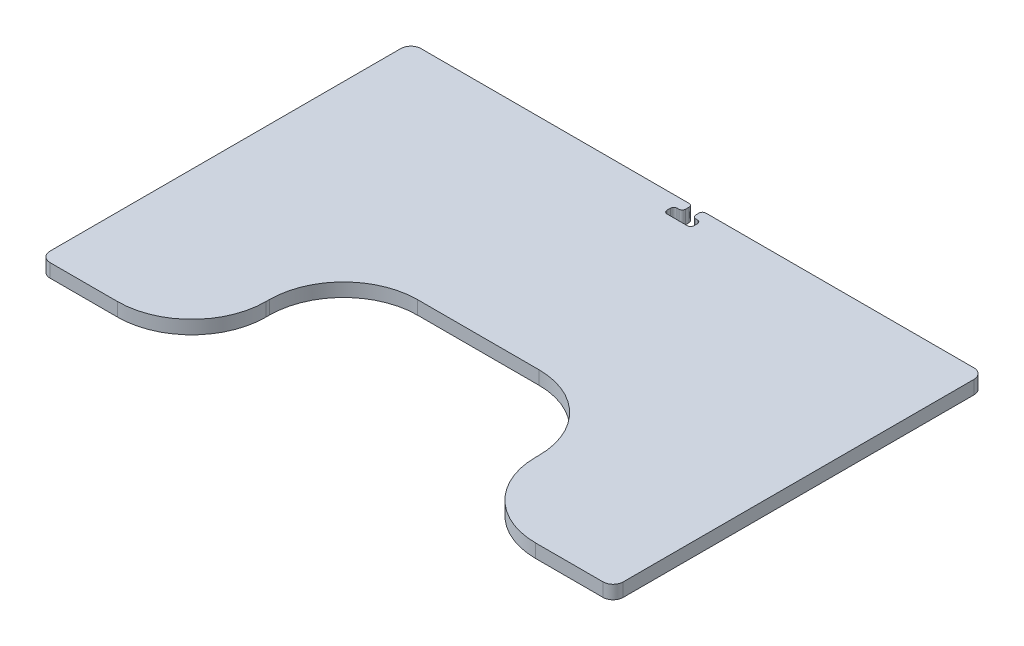
ISO-10303-21;
HEADER;
FILE_DESCRIPTION(('STEP AP214'),'2;1');
FILE_NAME('part.step','',(''),(''),'','','');
FILE_SCHEMA(('AUTOMOTIVE_DESIGN { 1 0 10303 214 1 1 1 1 }'));
ENDSEC;
DATA;
#1=APPLICATION_CONTEXT('core data for automotive mechanical design processes');
#2=APPLICATION_PROTOCOL_DEFINITION('international standard','automotive_design',2000,#1);
#3=PRODUCT_CONTEXT('',#1,'mechanical');
#4=PRODUCT('Part','Part','',(#3));
#5=PRODUCT_RELATED_PRODUCT_CATEGORY('part','',(#4));
#6=PRODUCT_DEFINITION_FORMATION('','',#4);
#7=PRODUCT_DEFINITION_CONTEXT('part definition',#1,'design');
#8=PRODUCT_DEFINITION('design','',#6,#7);
#9=PRODUCT_DEFINITION_SHAPE('','',#8);
#10=(LENGTH_UNIT() NAMED_UNIT(*) SI_UNIT(.MILLI.,.METRE.));
#11=(NAMED_UNIT(*) PLANE_ANGLE_UNIT() SI_UNIT($,.RADIAN.));
#12=(NAMED_UNIT(*) SI_UNIT($,.STERADIAN.) SOLID_ANGLE_UNIT());
#13=UNCERTAINTY_MEASURE_WITH_UNIT(LENGTH_MEASURE(1.E-05),#10,'distance_accuracy_value','');
#14=(GEOMETRIC_REPRESENTATION_CONTEXT(3) GLOBAL_UNCERTAINTY_ASSIGNED_CONTEXT((#13)) GLOBAL_UNIT_ASSIGNED_CONTEXT((#10,
#11,#12)) REPRESENTATION_CONTEXT('',''));
#15=CARTESIAN_POINT('',(0.,0.,0.));
#16=DIRECTION('',(0.,0.,1.));
#17=DIRECTION('',(1.,0.,0.));
#18=AXIS2_PLACEMENT_3D('',#15,#16,#17);
#19=CARTESIAN_POINT('',(850.,40.,-1100.));
#20=DIRECTION('',(0.,0.,1.));
#21=DIRECTION('',(1.,0.,0.));
#22=AXIS2_PLACEMENT_3D('',#19,#20,#21);
#23=PLANE('',#22);
#24=DIRECTION('',(-1.,0.,0.));
#25=VECTOR('',#24,1.);
#26=CARTESIAN_POINT('',(850.,40.,-1100.));
#27=LINE('',#26,#25);
#28=CARTESIAN_POINT('',(-25.,40.,-1100.));
#29=VERTEX_POINT('',#28);
#30=CARTESIAN_POINT('',(-820.,40.,-1100.));
#31=VERTEX_POINT('',#30);
#32=EDGE_CURVE('E461',#29,#31,#27,.T.);
#33=ORIENTED_EDGE('',*,*,#32,.F.);
#34=DIRECTION('',(0.,-1.,0.));
#35=VECTOR('',#34,1.);
#36=CARTESIAN_POINT('',(-25.,40.,-1100.));
#37=LINE('',#36,#35);
#38=CARTESIAN_POINT('',(-25.,0.,-1100.));
#39=VERTEX_POINT('',#38);
#40=EDGE_CURVE('E417',#29,#39,#37,.T.);
#41=ORIENTED_EDGE('',*,*,#40,.T.);
#42=DIRECTION('',(-1.,0.,0.));
#43=VECTOR('',#42,1.);
#44=CARTESIAN_POINT('',(850.,0.,-1100.));
#45=LINE('',#44,#43);
#46=CARTESIAN_POINT('',(-820.,0.,-1100.));
#47=VERTEX_POINT('',#46);
#48=EDGE_CURVE('E482',#39,#47,#45,.T.);
#49=ORIENTED_EDGE('',*,*,#48,.T.);
#50=DIRECTION('',(0.,-1.,0.));
#51=VECTOR('',#50,1.);
#52=CARTESIAN_POINT('',(-820.,40.,-1100.));
#53=LINE('',#52,#51);
#54=EDGE_CURVE('E324',#47,#31,#53,.F.);
#55=ORIENTED_EDGE('',*,*,#54,.T.);
#56=EDGE_LOOP('',(#33,#41,#49,#55));
#57=FACE_BOUND('',#56,.T.);
#58=ADVANCED_FACE('F34',(#57),#23,.F.);
#59=CARTESIAN_POINT('',(-400.,40.,-450.));
#60=DIRECTION('',(0.,0.,-1.));
#61=DIRECTION('',(-1.,0.,0.));
#62=AXIS2_PLACEMENT_3D('',#59,#60,#61);
#63=PLANE('',#62);
#64=DIRECTION('',(1.,0.,0.));
#65=VECTOR('',#64,1.);
#66=CARTESIAN_POINT('',(-400.,40.,-450.));
#67=LINE('',#66,#65);
#68=CARTESIAN_POINT('',(-180.,40.,-450.));
#69=VERTEX_POINT('',#68);
#70=CARTESIAN_POINT('',(180.,40.,-450.));
#71=VERTEX_POINT('',#70);
#72=EDGE_CURVE('E270',#69,#71,#67,.T.);
#73=ORIENTED_EDGE('',*,*,#72,.F.);
#74=DIRECTION('',(0.,-1.,0.));
#75=VECTOR('',#74,1.);
#76=CARTESIAN_POINT('',(-180.,0.,-450.));
#77=LINE('',#76,#75);
#78=CARTESIAN_POINT('',(-180.,0.,-450.));
#79=VERTEX_POINT('',#78);
#80=EDGE_CURVE('E289',#69,#79,#77,.T.);
#81=ORIENTED_EDGE('',*,*,#80,.T.);
#82=DIRECTION('',(1.,0.,0.));
#83=VECTOR('',#82,1.);
#84=CARTESIAN_POINT('',(-400.,0.,-450.));
#85=LINE('',#84,#83);
#86=CARTESIAN_POINT('',(180.,0.,-450.));
#87=VERTEX_POINT('',#86);
#88=EDGE_CURVE('E447',#79,#87,#85,.T.);
#89=ORIENTED_EDGE('',*,*,#88,.T.);
#90=DIRECTION('',(0.,-1.,0.));
#91=VECTOR('',#90,1.);
#92=CARTESIAN_POINT('',(180.,40.,-450.));
#93=LINE('',#92,#91);
#94=EDGE_CURVE('E287',#87,#71,#93,.F.);
#95=ORIENTED_EDGE('',*,*,#94,.T.);
#96=EDGE_LOOP('',(#73,#81,#89,#95));
#97=FACE_BOUND('',#96,.T.);
#98=ADVANCED_FACE('F506',(#97),#63,.F.);
#99=CARTESIAN_POINT('',(400.,40.,0.));
#100=DIRECTION('',(1.,0.,0.));
#101=DIRECTION('',(0.,0.,-1.));
#102=AXIS2_PLACEMENT_3D('',#99,#100,#101);
#103=PLANE('',#102);
#104=DIRECTION('',(0.,0.,1.));
#105=VECTOR('',#104,1.);
#106=CARTESIAN_POINT('',(400.,0.,0.));
#107=LINE('',#106,#105);
#108=CARTESIAN_POINT('',(400.,0.,-230.));
#109=VERTEX_POINT('',#108);
#110=CARTESIAN_POINT('',(400.,0.,-220.));
#111=VERTEX_POINT('',#110);
#112=EDGE_CURVE('E473',#109,#111,#107,.T.);
#113=ORIENTED_EDGE('',*,*,#112,.T.);
#114=DIRECTION('',(0.,-1.,0.));
#115=VECTOR('',#114,1.);
#116=CARTESIAN_POINT('',(400.,40.,-220.));
#117=LINE('',#116,#115);
#118=CARTESIAN_POINT('',(400.,40.,-220.));
#119=VERTEX_POINT('',#118);
#120=EDGE_CURVE('E298',#111,#119,#117,.F.);
#121=ORIENTED_EDGE('',*,*,#120,.T.);
#122=DIRECTION('',(0.,0.,1.));
#123=VECTOR('',#122,1.);
#124=CARTESIAN_POINT('',(400.,40.,0.));
#125=LINE('',#124,#123);
#126=CARTESIAN_POINT('',(400.,40.,-230.));
#127=VERTEX_POINT('',#126);
#128=EDGE_CURVE('E274',#127,#119,#125,.T.);
#129=ORIENTED_EDGE('',*,*,#128,.F.);
#130=DIRECTION('',(0.,-1.,0.));
#131=VECTOR('',#130,1.);
#132=CARTESIAN_POINT('',(400.,0.,-230.));
#133=LINE('',#132,#131);
#134=EDGE_CURVE('E295',#127,#109,#133,.T.);
#135=ORIENTED_EDGE('',*,*,#134,.T.);
#136=EDGE_LOOP('',(#113,#121,#129,#135));
#137=FACE_BOUND('',#136,.T.);
#138=ADVANCED_FACE('F515',(#137),#103,.F.);
#139=CARTESIAN_POINT('',(850.,40.,0.));
#140=DIRECTION('',(0.,0.,-1.));
#141=DIRECTION('',(-1.,0.,0.));
#142=AXIS2_PLACEMENT_3D('',#139,#140,#141);
#143=PLANE('',#142);
#144=DIRECTION('',(1.,0.,0.));
#145=VECTOR('',#144,1.);
#146=CARTESIAN_POINT('',(850.,0.,0.));
#147=LINE('',#146,#145);
#148=CARTESIAN_POINT('',(620.,0.,0.));
#149=VERTEX_POINT('',#148);
#150=CARTESIAN_POINT('',(820.,0.,0.));
#151=VERTEX_POINT('',#150);
#152=EDGE_CURVE('E476',#149,#151,#147,.T.);
#153=ORIENTED_EDGE('',*,*,#152,.T.);
#154=DIRECTION('',(0.,-1.,0.));
#155=VECTOR('',#154,1.);
#156=CARTESIAN_POINT('',(820.,40.,0.));
#157=LINE('',#156,#155);
#158=CARTESIAN_POINT('',(820.,40.,0.));
#159=VERTEX_POINT('',#158);
#160=EDGE_CURVE('E340',#151,#159,#157,.F.);
#161=ORIENTED_EDGE('',*,*,#160,.T.);
#162=DIRECTION('',(1.,0.,0.));
#163=VECTOR('',#162,1.);
#164=CARTESIAN_POINT('',(850.,40.,0.));
#165=LINE('',#164,#163);
#166=CARTESIAN_POINT('',(620.,40.,0.));
#167=VERTEX_POINT('',#166);
#168=EDGE_CURVE('E455',#167,#159,#165,.T.);
#169=ORIENTED_EDGE('',*,*,#168,.F.);
#170=DIRECTION('',(0.,-1.,0.));
#171=VECTOR('',#170,1.);
#172=CARTESIAN_POINT('',(620.,40.,0.));
#173=LINE('',#172,#171);
#174=EDGE_CURVE('E292',#167,#149,#173,.T.);
#175=ORIENTED_EDGE('',*,*,#174,.T.);
#176=EDGE_LOOP('',(#153,#161,#169,#175));
#177=FACE_BOUND('',#176,.T.);
#178=ADVANCED_FACE('F524',(#177),#143,.F.);
#179=CARTESIAN_POINT('',(850.,40.,-1100.));
#180=DIRECTION('',(-1.,0.,0.));
#181=DIRECTION('',(0.,0.,1.));
#182=AXIS2_PLACEMENT_3D('',#179,#180,#181);
#183=PLANE('',#182);
#184=DIRECTION('',(0.,0.,-1.));
#185=VECTOR('',#184,1.);
#186=CARTESIAN_POINT('',(850.,0.,-1100.));
#187=LINE('',#186,#185);
#188=CARTESIAN_POINT('',(850.,0.,-30.));
#189=VERTEX_POINT('',#188);
#190=CARTESIAN_POINT('',(850.,0.,-1070.));
#191=VERTEX_POINT('',#190);
#192=EDGE_CURVE('E479',#189,#191,#187,.T.);
#193=ORIENTED_EDGE('',*,*,#192,.T.);
#194=DIRECTION('',(0.,-1.,0.));
#195=VECTOR('',#194,1.);
#196=CARTESIAN_POINT('',(850.,40.,-1070.));
#197=LINE('',#196,#195);
#198=CARTESIAN_POINT('',(850.,40.,-1070.));
#199=VERTEX_POINT('',#198);
#200=EDGE_CURVE('E338',#191,#199,#197,.F.);
#201=ORIENTED_EDGE('',*,*,#200,.T.);
#202=DIRECTION('',(0.,0.,-1.));
#203=VECTOR('',#202,1.);
#204=CARTESIAN_POINT('',(850.,40.,-1100.));
#205=LINE('',#204,#203);
#206=CARTESIAN_POINT('',(850.,40.,-30.));
#207=VERTEX_POINT('',#206);
#208=EDGE_CURVE('E458',#207,#199,#205,.T.);
#209=ORIENTED_EDGE('',*,*,#208,.F.);
#210=DIRECTION('',(0.,-1.,0.));
#211=VECTOR('',#210,1.);
#212=CARTESIAN_POINT('',(850.,40.,-30.));
#213=LINE('',#212,#211);
#214=EDGE_CURVE('E335',#207,#189,#213,.T.);
#215=ORIENTED_EDGE('',*,*,#214,.T.);
#216=EDGE_LOOP('',(#193,#201,#209,#215));
#217=FACE_BOUND('',#216,.T.);
#218=ADVANCED_FACE('F533',(#217),#183,.F.);
#219=CARTESIAN_POINT('',(820.,0.,-1100.));
#220=VERTEX_POINT('',#219);
#221=CARTESIAN_POINT('',(25.,0.,-1100.));
#222=VERTEX_POINT('',#221);
#223=EDGE_CURVE('E483',#220,#222,#45,.T.);
#224=ORIENTED_EDGE('',*,*,#223,.T.);
#225=DIRECTION('',(0.,-1.,0.));
#226=VECTOR('',#225,1.);
#227=CARTESIAN_POINT('',(25.,40.,-1100.));
#228=LINE('',#227,#226);
#229=CARTESIAN_POINT('',(25.,40.,-1100.));
#230=VERTEX_POINT('',#229);
#231=EDGE_CURVE('E378',#222,#230,#228,.F.);
#232=ORIENTED_EDGE('',*,*,#231,.T.);
#233=CARTESIAN_POINT('',(820.,40.,-1100.));
#234=VERTEX_POINT('',#233);
#235=EDGE_CURVE('E462',#234,#230,#27,.T.);
#236=ORIENTED_EDGE('',*,*,#235,.F.);
#237=DIRECTION('',(0.,-1.,0.));
#238=VECTOR('',#237,1.);
#239=CARTESIAN_POINT('',(820.,40.,-1100.));
#240=LINE('',#239,#238);
#241=EDGE_CURVE('E321',#234,#220,#240,.T.);
#242=ORIENTED_EDGE('',*,*,#241,.T.);
#243=EDGE_LOOP('',(#224,#232,#236,#242));
#244=FACE_BOUND('',#243,.T.);
#245=ADVANCED_FACE('F542',(#244),#23,.F.);
#246=CARTESIAN_POINT('',(-850.,40.,-1100.));
#247=DIRECTION('',(1.,0.,0.));
#248=DIRECTION('',(0.,0.,-1.));
#249=AXIS2_PLACEMENT_3D('',#246,#247,#248);
#250=PLANE('',#249);
#251=DIRECTION('',(0.,0.,1.));
#252=VECTOR('',#251,1.);
#253=CARTESIAN_POINT('',(-850.,40.,-1100.));
#254=LINE('',#253,#252);
#255=CARTESIAN_POINT('',(-850.,40.,-1070.));
#256=VERTEX_POINT('',#255);
#257=CARTESIAN_POINT('',(-850.,40.,-30.));
#258=VERTEX_POINT('',#257);
#259=EDGE_CURVE('E465',#256,#258,#254,.T.);
#260=ORIENTED_EDGE('',*,*,#259,.F.);
#261=DIRECTION('',(0.,-1.,0.));
#262=VECTOR('',#261,1.);
#263=CARTESIAN_POINT('',(-850.,40.,-1070.));
#264=LINE('',#263,#262);
#265=CARTESIAN_POINT('',(-850.,0.,-1070.));
#266=VERTEX_POINT('',#265);
#267=EDGE_CURVE('E309',#256,#266,#264,.T.);
#268=ORIENTED_EDGE('',*,*,#267,.T.);
#269=DIRECTION('',(0.,0.,1.));
#270=VECTOR('',#269,1.);
#271=CARTESIAN_POINT('',(-850.,0.,-1100.));
#272=LINE('',#271,#270);
#273=CARTESIAN_POINT('',(-850.,0.,-30.));
#274=VERTEX_POINT('',#273);
#275=EDGE_CURVE('E276',#266,#274,#272,.T.);
#276=ORIENTED_EDGE('',*,*,#275,.T.);
#277=DIRECTION('',(0.,-1.,0.));
#278=VECTOR('',#277,1.);
#279=CARTESIAN_POINT('',(-850.,40.,-30.));
#280=LINE('',#279,#278);
#281=EDGE_CURVE('E307',#274,#258,#280,.F.);
#282=ORIENTED_EDGE('',*,*,#281,.T.);
#283=EDGE_LOOP('',(#260,#268,#276,#282));
#284=FACE_BOUND('',#283,.T.);
#285=ADVANCED_FACE('F490',(#284),#250,.F.);
#286=CARTESIAN_POINT('',(-850.,40.,0.));
#287=DIRECTION('',(0.,0.,-1.));
#288=DIRECTION('',(-1.,0.,0.));
#289=AXIS2_PLACEMENT_3D('',#286,#287,#288);
#290=PLANE('',#289);
#291=DIRECTION('',(1.,0.,0.));
#292=VECTOR('',#291,1.);
#293=CARTESIAN_POINT('',(-850.,40.,0.));
#294=LINE('',#293,#292);
#295=CARTESIAN_POINT('',(-820.,40.,0.));
#296=VERTEX_POINT('',#295);
#297=CARTESIAN_POINT('',(-620.,40.,0.));
#298=VERTEX_POINT('',#297);
#299=EDGE_CURVE('E468',#296,#298,#294,.T.);
#300=ORIENTED_EDGE('',*,*,#299,.F.);
#301=DIRECTION('',(0.,-1.,0.));
#302=VECTOR('',#301,1.);
#303=CARTESIAN_POINT('',(-820.,40.,0.));
#304=LINE('',#303,#302);
#305=CARTESIAN_POINT('',(-820.,0.,0.));
#306=VERTEX_POINT('',#305);
#307=EDGE_CURVE('E342',#296,#306,#304,.T.);
#308=ORIENTED_EDGE('',*,*,#307,.T.);
#309=DIRECTION('',(1.,0.,0.));
#310=VECTOR('',#309,1.);
#311=CARTESIAN_POINT('',(-850.,0.,0.));
#312=LINE('',#311,#310);
#313=CARTESIAN_POINT('',(-620.,0.,0.));
#314=VERTEX_POINT('',#313);
#315=EDGE_CURVE('E271',#306,#314,#312,.T.);
#316=ORIENTED_EDGE('',*,*,#315,.T.);
#317=DIRECTION('',(0.,-1.,0.));
#318=VECTOR('',#317,1.);
#319=CARTESIAN_POINT('',(-620.,40.,0.));
#320=LINE('',#319,#318);
#321=EDGE_CURVE('E250',#314,#298,#320,.F.);
#322=ORIENTED_EDGE('',*,*,#321,.T.);
#323=EDGE_LOOP('',(#300,#308,#316,#322));
#324=FACE_BOUND('',#323,.T.);
#325=ADVANCED_FACE('F499',(#324),#290,.F.);
#326=CARTESIAN_POINT('',(-400.,40.,0.));
#327=DIRECTION('',(-1.,0.,0.));
#328=DIRECTION('',(0.,0.,1.));
#329=AXIS2_PLACEMENT_3D('',#326,#327,#328);
#330=PLANE('',#329);
#331=DIRECTION('',(0.,0.,-1.));
#332=VECTOR('',#331,1.);
#333=CARTESIAN_POINT('',(-400.,40.,0.));
#334=LINE('',#333,#332);
#335=CARTESIAN_POINT('',(-400.,40.,-220.));
#336=VERTEX_POINT('',#335);
#337=CARTESIAN_POINT('',(-400.,40.,-230.));
#338=VERTEX_POINT('',#337);
#339=EDGE_CURVE('E263',#336,#338,#334,.T.);
#340=ORIENTED_EDGE('',*,*,#339,.F.);
#341=DIRECTION('',(0.,-1.,0.));
#342=VECTOR('',#341,1.);
#343=CARTESIAN_POINT('',(-400.,40.,-220.));
#344=LINE('',#343,#342);
#345=CARTESIAN_POINT('',(-400.,0.,-220.));
#346=VERTEX_POINT('',#345);
#347=EDGE_CURVE('E248',#336,#346,#344,.T.);
#348=ORIENTED_EDGE('',*,*,#347,.T.);
#349=DIRECTION('',(0.,0.,-1.));
#350=VECTOR('',#349,1.);
#351=CARTESIAN_POINT('',(-400.,0.,0.));
#352=LINE('',#351,#350);
#353=CARTESIAN_POINT('',(-400.,0.,-230.));
#354=VERTEX_POINT('',#353);
#355=EDGE_CURVE('E260',#346,#354,#352,.T.);
#356=ORIENTED_EDGE('',*,*,#355,.T.);
#357=DIRECTION('',(0.,-1.,0.));
#358=VECTOR('',#357,1.);
#359=CARTESIAN_POINT('',(-400.,40.,-230.));
#360=LINE('',#359,#358);
#361=EDGE_CURVE('E264',#354,#338,#360,.F.);
#362=ORIENTED_EDGE('',*,*,#361,.T.);
#363=EDGE_LOOP('',(#340,#348,#356,#362));
#364=FACE_BOUND('',#363,.T.);
#365=ADVANCED_FACE('F259',(#364),#330,.F.);
#366=CARTESIAN_POINT('',(0.,40.,0.));
#367=DIRECTION('',(0.,1.,0.));
#368=DIRECTION('',(0.,0.,1.));
#369=AXIS2_PLACEMENT_3D('',#366,#367,#368);
#370=PLANE('',#369);
#371=ORIENTED_EDGE('',*,*,#235,.T.);
#372=CARTESIAN_POINT('',(25.,40.,-1090.));
#373=DIRECTION('',(0.,1.,0.));
#374=DIRECTION('',(0.,0.,1.));
#375=AXIS2_PLACEMENT_3D('',#372,#373,#374);
#376=CIRCLE('',#375,10.);
#377=CARTESIAN_POINT('',(15.,40.,-1090.));
#378=VERTEX_POINT('',#377);
#379=EDGE_CURVE('E386',#230,#378,#376,.T.);
#380=ORIENTED_EDGE('',*,*,#379,.T.);
#381=DIRECTION('',(0.,0.,-1.));
#382=VECTOR('',#381,1.);
#383=CARTESIAN_POINT('',(15.,40.,0.));
#384=LINE('',#383,#382);
#385=CARTESIAN_POINT('',(15.,40.,-1080.));
#386=VERTEX_POINT('',#385);
#387=EDGE_CURVE('E554',#386,#378,#384,.T.);
#388=ORIENTED_EDGE('',*,*,#387,.F.);
#389=CARTESIAN_POINT('',(25.,40.,-1080.));
#390=DIRECTION('',(0.,1.,0.));
#391=DIRECTION('',(0.,0.,1.));
#392=AXIS2_PLACEMENT_3D('',#389,#390,#391);
#393=CIRCLE('',#392,10.);
#394=CARTESIAN_POINT('',(25.0000000000001,40.,-1070.));
#395=VERTEX_POINT('',#394);
#396=EDGE_CURVE('E384',#386,#395,#393,.T.);
#397=ORIENTED_EDGE('',*,*,#396,.T.);
#398=DIRECTION('',(-1.,0.,0.));
#399=VECTOR('',#398,1.);
#400=CARTESIAN_POINT('',(-9.50350909079133E-12,40.,-1070.));
#401=LINE('',#400,#399);
#402=CARTESIAN_POINT('',(29.9999999999999,40.,-1070.));
#403=VERTEX_POINT('',#402);
#404=EDGE_CURVE('E556',#403,#395,#401,.T.);
#405=ORIENTED_EDGE('',*,*,#404,.F.);
#406=CARTESIAN_POINT('',(30.,40.,-1060.));
#407=DIRECTION('',(0.,1.,0.));
#408=DIRECTION('',(0.,0.,1.));
#409=AXIS2_PLACEMENT_3D('',#406,#407,#408);
#410=CIRCLE('',#409,10.);
#411=CARTESIAN_POINT('',(40.,40.,-1060.));
#412=VERTEX_POINT('',#411);
#413=EDGE_CURVE('E422',#403,#412,#410,.F.);
#414=ORIENTED_EDGE('',*,*,#413,.T.);
#415=DIRECTION('',(0.,0.,-1.));
#416=VECTOR('',#415,1.);
#417=CARTESIAN_POINT('',(39.9999999999961,40.,1.48029736616673E-13));
#418=LINE('',#417,#416);
#419=CARTESIAN_POINT('',(40.,40.,-1050.));
#420=VERTEX_POINT('',#419);
#421=EDGE_CURVE('E559',#420,#412,#418,.T.);
#422=ORIENTED_EDGE('',*,*,#421,.F.);
#423=CARTESIAN_POINT('',(30.,40.,-1050.));
#424=DIRECTION('',(0.,1.,0.));
#425=DIRECTION('',(0.,0.,1.));
#426=AXIS2_PLACEMENT_3D('',#423,#424,#425);
#427=CIRCLE('',#426,10.);
#428=CARTESIAN_POINT('',(30.,40.,-1040.));
#429=VERTEX_POINT('',#428);
#430=EDGE_CURVE('E426',#420,#429,#427,.F.);
#431=ORIENTED_EDGE('',*,*,#430,.T.);
#432=DIRECTION('',(1.,0.,0.));
#433=VECTOR('',#432,1.);
#434=CARTESIAN_POINT('',(-2.88657986402541E-12,40.,-1040.));
#435=LINE('',#434,#433);
#436=CARTESIAN_POINT('',(-30.0000000000001,40.,-1040.));
#437=VERTEX_POINT('',#436);
#438=EDGE_CURVE('E449',#437,#429,#435,.T.);
#439=ORIENTED_EDGE('',*,*,#438,.F.);
#440=CARTESIAN_POINT('',(-30.0000000000001,40.,-1050.));
#441=DIRECTION('',(0.,1.,0.));
#442=DIRECTION('',(0.,0.,1.));
#443=AXIS2_PLACEMENT_3D('',#440,#441,#442);
#444=CIRCLE('',#443,10.);
#445=CARTESIAN_POINT('',(-40.0000000000001,40.,-1050.));
#446=VERTEX_POINT('',#445);
#447=EDGE_CURVE('E430',#437,#446,#444,.F.);
#448=ORIENTED_EDGE('',*,*,#447,.T.);
#449=DIRECTION('',(0.,0.,1.));
#450=VECTOR('',#449,1.);
#451=CARTESIAN_POINT('',(-40.000000000004,40.,-1.48029736616701E-13));
#452=LINE('',#451,#450);
#453=CARTESIAN_POINT('',(-40.0000000000001,40.,-1060.));
#454=VERTEX_POINT('',#453);
#455=EDGE_CURVE('E444',#454,#446,#452,.T.);
#456=ORIENTED_EDGE('',*,*,#455,.F.);
#457=CARTESIAN_POINT('',(-30.0000000000001,40.,-1060.));
#458=DIRECTION('',(0.,1.,0.));
#459=DIRECTION('',(0.,0.,1.));
#460=AXIS2_PLACEMENT_3D('',#457,#458,#459);
#461=CIRCLE('',#460,10.);
#462=CARTESIAN_POINT('',(-30.,40.,-1070.));
#463=VERTEX_POINT('',#462);
#464=EDGE_CURVE('E11',#454,#463,#461,.F.);
#465=ORIENTED_EDGE('',*,*,#464,.T.);
#466=DIRECTION('',(-1.,0.,0.));
#467=VECTOR('',#466,1.);
#468=CARTESIAN_POINT('',(9.50350909079133E-12,40.,-1070.));
#469=LINE('',#468,#467);
#470=CARTESIAN_POINT('',(-25.0000000000001,40.,-1070.));
#471=VERTEX_POINT('',#470);
#472=EDGE_CURVE('E441',#471,#463,#469,.T.);
#473=ORIENTED_EDGE('',*,*,#472,.F.);
#474=CARTESIAN_POINT('',(-25.,40.,-1080.));
#475=DIRECTION('',(0.,1.,0.));
#476=DIRECTION('',(0.,0.,1.));
#477=AXIS2_PLACEMENT_3D('',#474,#475,#476);
#478=CIRCLE('',#477,10.);
#479=CARTESIAN_POINT('',(-15.,40.,-1080.));
#480=VERTEX_POINT('',#479);
#481=EDGE_CURVE('E382',#471,#480,#478,.T.);
#482=ORIENTED_EDGE('',*,*,#481,.T.);
#483=DIRECTION('',(0.,0.,1.));
#484=VECTOR('',#483,1.);
#485=CARTESIAN_POINT('',(-15.,40.,0.));
#486=LINE('',#485,#484);
#487=CARTESIAN_POINT('',(-15.,40.,-1090.));
#488=VERTEX_POINT('',#487);
#489=EDGE_CURVE('E443',#488,#480,#486,.T.);
#490=ORIENTED_EDGE('',*,*,#489,.F.);
#491=CARTESIAN_POINT('',(-25.,40.,-1090.));
#492=DIRECTION('',(0.,1.,0.));
#493=DIRECTION('',(0.,0.,1.));
#494=AXIS2_PLACEMENT_3D('',#491,#492,#493);
#495=CIRCLE('',#494,10.);
#496=EDGE_CURVE('E380',#488,#29,#495,.T.);
#497=ORIENTED_EDGE('',*,*,#496,.T.);
#498=ORIENTED_EDGE('',*,*,#32,.T.);
#499=CARTESIAN_POINT('',(-820.,40.,-1070.));
#500=DIRECTION('',(0.,1.,0.));
#501=DIRECTION('',(0.,0.,1.));
#502=AXIS2_PLACEMENT_3D('',#499,#500,#501);
#503=CIRCLE('',#502,30.);
#504=EDGE_CURVE('E333',#31,#256,#503,.T.);
#505=ORIENTED_EDGE('',*,*,#504,.T.);
#506=ORIENTED_EDGE('',*,*,#259,.T.);
#507=CARTESIAN_POINT('',(-820.,40.,-30.));
#508=DIRECTION('',(0.,1.,0.));
#509=DIRECTION('',(0.,0.,1.));
#510=AXIS2_PLACEMENT_3D('',#507,#508,#509);
#511=CIRCLE('',#510,30.);
#512=EDGE_CURVE('E327',#258,#296,#511,.T.);
#513=ORIENTED_EDGE('',*,*,#512,.T.);
#514=ORIENTED_EDGE('',*,*,#299,.T.);
#515=CARTESIAN_POINT('',(-620.,40.,-220.));
#516=DIRECTION('',(0.,1.,0.));
#517=DIRECTION('',(0.,0.,1.));
#518=AXIS2_PLACEMENT_3D('',#515,#516,#517);
#519=CIRCLE('',#518,220.);
#520=EDGE_CURVE('E285',#298,#336,#519,.T.);
#521=ORIENTED_EDGE('',*,*,#520,.T.);
#522=ORIENTED_EDGE('',*,*,#339,.T.);
#523=CARTESIAN_POINT('',(-180.,40.,-230.));
#524=DIRECTION('',(0.,1.,0.));
#525=DIRECTION('',(0.,0.,1.));
#526=AXIS2_PLACEMENT_3D('',#523,#524,#525);
#527=CIRCLE('',#526,220.);
#528=EDGE_CURVE('E301',#338,#69,#527,.F.);
#529=ORIENTED_EDGE('',*,*,#528,.T.);
#530=ORIENTED_EDGE('',*,*,#72,.T.);
#531=CARTESIAN_POINT('',(180.,40.,-230.));
#532=DIRECTION('',(0.,1.,0.));
#533=DIRECTION('',(0.,0.,1.));
#534=AXIS2_PLACEMENT_3D('',#531,#532,#533);
#535=CIRCLE('',#534,220.);
#536=EDGE_CURVE('E305',#71,#127,#535,.F.);
#537=ORIENTED_EDGE('',*,*,#536,.T.);
#538=ORIENTED_EDGE('',*,*,#128,.T.);
#539=CARTESIAN_POINT('',(620.,40.,-220.));
#540=DIRECTION('',(0.,1.,0.));
#541=DIRECTION('',(0.,0.,1.));
#542=AXIS2_PLACEMENT_3D('',#539,#540,#541);
#543=CIRCLE('',#542,220.);
#544=EDGE_CURVE('E283',#119,#167,#543,.T.);
#545=ORIENTED_EDGE('',*,*,#544,.T.);
#546=ORIENTED_EDGE('',*,*,#168,.T.);
#547=CARTESIAN_POINT('',(820.,40.,-30.));
#548=DIRECTION('',(0.,1.,0.));
#549=DIRECTION('',(0.,0.,1.));
#550=AXIS2_PLACEMENT_3D('',#547,#548,#549);
#551=CIRCLE('',#550,30.);
#552=EDGE_CURVE('E329',#159,#207,#551,.T.);
#553=ORIENTED_EDGE('',*,*,#552,.T.);
#554=ORIENTED_EDGE('',*,*,#208,.T.);
#555=CARTESIAN_POINT('',(820.,40.,-1070.));
#556=DIRECTION('',(0.,1.,0.));
#557=DIRECTION('',(0.,0.,1.));
#558=AXIS2_PLACEMENT_3D('',#555,#556,#557);
#559=CIRCLE('',#558,30.);
#560=EDGE_CURVE('E331',#199,#234,#559,.T.);
#561=ORIENTED_EDGE('',*,*,#560,.T.);
#562=EDGE_LOOP('',(#371,#380,#388,#397,#405,#414,#422,#431,#439,#448,#456,#465,#473,#482,#490,
#497,#498,#505,#506,#513,#514,#521,#522,#529,#530,#537,#538,#545,#546,#553,#554,#561));
#563=FACE_BOUND('',#562,.T.);
#564=ADVANCED_FACE('F497',(#563),#370,.T.);
#565=CARTESIAN_POINT('',(0.,0.,0.));
#566=DIRECTION('',(0.,1.,0.));
#567=DIRECTION('',(0.,0.,1.));
#568=AXIS2_PLACEMENT_3D('',#565,#566,#567);
#569=PLANE('',#568);
#570=DIRECTION('',(0.,0.,-1.));
#571=VECTOR('',#570,1.);
#572=CARTESIAN_POINT('',(15.,0.,0.));
#573=LINE('',#572,#571);
#574=CARTESIAN_POINT('',(15.,0.,-1080.));
#575=VERTEX_POINT('',#574);
#576=CARTESIAN_POINT('',(15.,0.,-1090.));
#577=VERTEX_POINT('',#576);
#578=EDGE_CURVE('E345',#575,#577,#573,.T.);
#579=ORIENTED_EDGE('',*,*,#578,.T.);
#580=CARTESIAN_POINT('',(25.,0.,-1090.));
#581=DIRECTION('',(0.,1.,0.));
#582=DIRECTION('',(0.,0.,1.));
#583=AXIS2_PLACEMENT_3D('',#580,#581,#582);
#584=CIRCLE('',#583,10.);
#585=EDGE_CURVE('E376',#577,#222,#584,.F.);
#586=ORIENTED_EDGE('',*,*,#585,.T.);
#587=ORIENTED_EDGE('',*,*,#223,.F.);
#588=CARTESIAN_POINT('',(820.,0.,-1070.));
#589=DIRECTION('',(0.,1.,0.));
#590=DIRECTION('',(0.,0.,1.));
#591=AXIS2_PLACEMENT_3D('',#588,#589,#590);
#592=CIRCLE('',#591,30.);
#593=EDGE_CURVE('E316',#220,#191,#592,.F.);
#594=ORIENTED_EDGE('',*,*,#593,.T.);
#595=ORIENTED_EDGE('',*,*,#192,.F.);
#596=CARTESIAN_POINT('',(820.,0.,-30.));
#597=DIRECTION('',(0.,1.,0.));
#598=DIRECTION('',(0.,0.,1.));
#599=AXIS2_PLACEMENT_3D('',#596,#597,#598);
#600=CIRCLE('',#599,30.);
#601=EDGE_CURVE('E314',#189,#151,#600,.F.);
#602=ORIENTED_EDGE('',*,*,#601,.T.);
#603=ORIENTED_EDGE('',*,*,#152,.F.);
#604=CARTESIAN_POINT('',(620.,0.,-220.));
#605=DIRECTION('',(0.,1.,0.));
#606=DIRECTION('',(0.,0.,1.));
#607=AXIS2_PLACEMENT_3D('',#604,#605,#606);
#608=CIRCLE('',#607,220.);
#609=EDGE_CURVE('E254',#149,#111,#608,.F.);
#610=ORIENTED_EDGE('',*,*,#609,.T.);
#611=ORIENTED_EDGE('',*,*,#112,.F.);
#612=CARTESIAN_POINT('',(180.,0.,-230.));
#613=DIRECTION('',(0.,1.,0.));
#614=DIRECTION('',(0.,0.,1.));
#615=AXIS2_PLACEMENT_3D('',#612,#613,#614);
#616=CIRCLE('',#615,220.);
#617=EDGE_CURVE('E303',#109,#87,#616,.T.);
#618=ORIENTED_EDGE('',*,*,#617,.T.);
#619=ORIENTED_EDGE('',*,*,#88,.F.);
#620=CARTESIAN_POINT('',(-180.,0.,-230.));
#621=DIRECTION('',(0.,1.,0.));
#622=DIRECTION('',(0.,0.,1.));
#623=AXIS2_PLACEMENT_3D('',#620,#621,#622);
#624=CIRCLE('',#623,220.);
#625=EDGE_CURVE('E269',#79,#354,#624,.T.);
#626=ORIENTED_EDGE('',*,*,#625,.T.);
#627=ORIENTED_EDGE('',*,*,#355,.F.);
#628=CARTESIAN_POINT('',(-620.,0.,-220.));
#629=DIRECTION('',(0.,1.,0.));
#630=DIRECTION('',(0.,0.,1.));
#631=AXIS2_PLACEMENT_3D('',#628,#629,#630);
#632=CIRCLE('',#631,220.);
#633=EDGE_CURVE('E244',#346,#314,#632,.F.);
#634=ORIENTED_EDGE('',*,*,#633,.T.);
#635=ORIENTED_EDGE('',*,*,#315,.F.);
#636=CARTESIAN_POINT('',(-820.,0.,-30.));
#637=DIRECTION('',(0.,1.,0.));
#638=DIRECTION('',(0.,0.,1.));
#639=AXIS2_PLACEMENT_3D('',#636,#637,#638);
#640=CIRCLE('',#639,30.);
#641=EDGE_CURVE('E312',#306,#274,#640,.F.);
#642=ORIENTED_EDGE('',*,*,#641,.T.);
#643=ORIENTED_EDGE('',*,*,#275,.F.);
#644=CARTESIAN_POINT('',(-820.,0.,-1070.));
#645=DIRECTION('',(0.,1.,0.));
#646=DIRECTION('',(0.,0.,1.));
#647=AXIS2_PLACEMENT_3D('',#644,#645,#646);
#648=CIRCLE('',#647,30.);
#649=EDGE_CURVE('E318',#266,#47,#648,.F.);
#650=ORIENTED_EDGE('',*,*,#649,.T.);
#651=ORIENTED_EDGE('',*,*,#48,.F.);
#652=CARTESIAN_POINT('',(-25.,0.,-1090.));
#653=DIRECTION('',(0.,1.,0.));
#654=DIRECTION('',(0.,0.,1.));
#655=AXIS2_PLACEMENT_3D('',#652,#653,#654);
#656=CIRCLE('',#655,10.);
#657=CARTESIAN_POINT('',(-15.,0.,-1090.));
#658=VERTEX_POINT('',#657);
#659=EDGE_CURVE('E370',#39,#658,#656,.F.);
#660=ORIENTED_EDGE('',*,*,#659,.T.);
#661=DIRECTION('',(0.,0.,1.));
#662=VECTOR('',#661,1.);
#663=CARTESIAN_POINT('',(-15.,0.,0.));
#664=LINE('',#663,#662);
#665=CARTESIAN_POINT('',(-15.,0.,-1080.));
#666=VERTEX_POINT('',#665);
#667=EDGE_CURVE('E362',#658,#666,#664,.T.);
#668=ORIENTED_EDGE('',*,*,#667,.T.);
#669=CARTESIAN_POINT('',(-25.,0.,-1080.));
#670=DIRECTION('',(0.,1.,0.));
#671=DIRECTION('',(0.,0.,1.));
#672=AXIS2_PLACEMENT_3D('',#669,#670,#671);
#673=CIRCLE('',#672,10.);
#674=CARTESIAN_POINT('',(-25.0000000000001,0.,-1070.));
#675=VERTEX_POINT('',#674);
#676=EDGE_CURVE('E372',#666,#675,#673,.F.);
#677=ORIENTED_EDGE('',*,*,#676,.T.);
#678=DIRECTION('',(-1.,0.,0.));
#679=VECTOR('',#678,1.);
#680=CARTESIAN_POINT('',(9.50350909079133E-12,0.,-1070.));
#681=LINE('',#680,#679);
#682=CARTESIAN_POINT('',(-30.,0.,-1070.));
#683=VERTEX_POINT('',#682);
#684=EDGE_CURVE('E359',#675,#683,#681,.T.);
#685=ORIENTED_EDGE('',*,*,#684,.T.);
#686=CARTESIAN_POINT('',(-30.0000000000001,0.,-1060.));
#687=DIRECTION('',(0.,1.,0.));
#688=DIRECTION('',(0.,0.,1.));
#689=AXIS2_PLACEMENT_3D('',#686,#687,#688);
#690=CIRCLE('',#689,10.);
#691=CARTESIAN_POINT('',(-40.0000000000001,0.,-1060.));
#692=VERTEX_POINT('',#691);
#693=EDGE_CURVE('E42',#683,#692,#690,.T.);
#694=ORIENTED_EDGE('',*,*,#693,.T.);
#695=DIRECTION('',(0.,0.,1.));
#696=VECTOR('',#695,1.);
#697=CARTESIAN_POINT('',(-40.000000000004,0.,-1.48029736616701E-13));
#698=LINE('',#697,#696);
#699=CARTESIAN_POINT('',(-40.0000000000001,0.,-1050.));
#700=VERTEX_POINT('',#699);
#701=EDGE_CURVE('E356',#692,#700,#698,.T.);
#702=ORIENTED_EDGE('',*,*,#701,.T.);
#703=CARTESIAN_POINT('',(-30.0000000000001,0.,-1050.));
#704=DIRECTION('',(0.,1.,0.));
#705=DIRECTION('',(0.,0.,1.));
#706=AXIS2_PLACEMENT_3D('',#703,#704,#705);
#707=CIRCLE('',#706,10.);
#708=CARTESIAN_POINT('',(-30.0000000000001,0.,-1040.));
#709=VERTEX_POINT('',#708);
#710=EDGE_CURVE('E428',#700,#709,#707,.T.);
#711=ORIENTED_EDGE('',*,*,#710,.T.);
#712=DIRECTION('',(1.,0.,0.));
#713=VECTOR('',#712,1.);
#714=CARTESIAN_POINT('',(-2.88657986402541E-12,0.,-1040.));
#715=LINE('',#714,#713);
#716=CARTESIAN_POINT('',(30.,0.,-1040.));
#717=VERTEX_POINT('',#716);
#718=EDGE_CURVE('E353',#709,#717,#715,.T.);
#719=ORIENTED_EDGE('',*,*,#718,.T.);
#720=CARTESIAN_POINT('',(30.,0.,-1050.));
#721=DIRECTION('',(0.,1.,0.));
#722=DIRECTION('',(0.,0.,1.));
#723=AXIS2_PLACEMENT_3D('',#720,#721,#722);
#724=CIRCLE('',#723,10.);
#725=CARTESIAN_POINT('',(40.,0.,-1050.));
#726=VERTEX_POINT('',#725);
#727=EDGE_CURVE('E424',#717,#726,#724,.T.);
#728=ORIENTED_EDGE('',*,*,#727,.T.);
#729=DIRECTION('',(0.,0.,-1.));
#730=VECTOR('',#729,1.);
#731=CARTESIAN_POINT('',(39.9999999999961,0.,1.48029736616673E-13));
#732=LINE('',#731,#730);
#733=CARTESIAN_POINT('',(40.,0.,-1060.));
#734=VERTEX_POINT('',#733);
#735=EDGE_CURVE('E350',#726,#734,#732,.T.);
#736=ORIENTED_EDGE('',*,*,#735,.T.);
#737=CARTESIAN_POINT('',(30.,0.,-1060.));
#738=DIRECTION('',(0.,1.,0.));
#739=DIRECTION('',(0.,0.,1.));
#740=AXIS2_PLACEMENT_3D('',#737,#738,#739);
#741=CIRCLE('',#740,10.);
#742=CARTESIAN_POINT('',(29.9999999999999,0.,-1070.));
#743=VERTEX_POINT('',#742);
#744=EDGE_CURVE('E420',#734,#743,#741,.T.);
#745=ORIENTED_EDGE('',*,*,#744,.T.);
#746=DIRECTION('',(-1.,0.,0.));
#747=VECTOR('',#746,1.);
#748=CARTESIAN_POINT('',(-9.50350909079133E-12,0.,-1070.));
#749=LINE('',#748,#747);
#750=CARTESIAN_POINT('',(25.0000000000001,0.,-1070.));
#751=VERTEX_POINT('',#750);
#752=EDGE_CURVE('E347',#743,#751,#749,.T.);
#753=ORIENTED_EDGE('',*,*,#752,.T.);
#754=CARTESIAN_POINT('',(25.,0.,-1080.));
#755=DIRECTION('',(0.,1.,0.));
#756=DIRECTION('',(0.,0.,1.));
#757=AXIS2_PLACEMENT_3D('',#754,#755,#756);
#758=CIRCLE('',#757,10.);
#759=EDGE_CURVE('E374',#751,#575,#758,.F.);
#760=ORIENTED_EDGE('',*,*,#759,.T.);
#761=EDGE_LOOP('',(#579,#586,#587,#594,#595,#602,#603,#610,#611,#618,#619,#626,#627,#634,#635,
#642,#643,#650,#651,#660,#668,#677,#685,#694,#702,#711,#719,#728,#736,#745,#753,#760));
#762=FACE_BOUND('',#761,.T.);
#763=ADVANCED_FACE('F267',(#762),#569,.F.);
#764=CARTESIAN_POINT('',(-620.,40.,-220.));
#765=DIRECTION('',(0.,-1.,0.));
#766=DIRECTION('',(0.,0.,-1.));
#767=AXIS2_PLACEMENT_3D('',#764,#765,#766);
#768=CYLINDRICAL_SURFACE('',#767,220.);
#769=ORIENTED_EDGE('',*,*,#520,.F.);
#770=ORIENTED_EDGE('',*,*,#321,.F.);
#771=ORIENTED_EDGE('',*,*,#633,.F.);
#772=ORIENTED_EDGE('',*,*,#347,.F.);
#773=EDGE_LOOP('',(#769,#770,#771,#772));
#774=FACE_BOUND('',#773,.T.);
#775=ADVANCED_FACE('F247',(#774),#768,.T.);
#776=CARTESIAN_POINT('',(-180.,40.,-230.));
#777=DIRECTION('',(0.,1.,0.));
#778=DIRECTION('',(0.,0.,1.));
#779=AXIS2_PLACEMENT_3D('',#776,#777,#778);
#780=CYLINDRICAL_SURFACE('',#779,220.);
#781=ORIENTED_EDGE('',*,*,#528,.F.);
#782=ORIENTED_EDGE('',*,*,#361,.F.);
#783=ORIENTED_EDGE('',*,*,#625,.F.);
#784=ORIENTED_EDGE('',*,*,#80,.F.);
#785=EDGE_LOOP('',(#781,#782,#783,#784));
#786=FACE_BOUND('',#785,.T.);
#787=ADVANCED_FACE('F504',(#786),#780,.F.);
#788=CARTESIAN_POINT('',(620.,40.,-220.));
#789=DIRECTION('',(0.,-1.,0.));
#790=DIRECTION('',(0.,0.,-1.));
#791=AXIS2_PLACEMENT_3D('',#788,#789,#790);
#792=CYLINDRICAL_SURFACE('',#791,220.);
#793=ORIENTED_EDGE('',*,*,#544,.F.);
#794=ORIENTED_EDGE('',*,*,#120,.F.);
#795=ORIENTED_EDGE('',*,*,#609,.F.);
#796=ORIENTED_EDGE('',*,*,#174,.F.);
#797=EDGE_LOOP('',(#793,#794,#795,#796));
#798=FACE_BOUND('',#797,.T.);
#799=ADVANCED_FACE('F521',(#798),#792,.T.);
#800=CARTESIAN_POINT('',(180.,40.,-230.));
#801=DIRECTION('',(0.,1.,0.));
#802=DIRECTION('',(0.,0.,1.));
#803=AXIS2_PLACEMENT_3D('',#800,#801,#802);
#804=CYLINDRICAL_SURFACE('',#803,220.);
#805=ORIENTED_EDGE('',*,*,#536,.F.);
#806=ORIENTED_EDGE('',*,*,#94,.F.);
#807=ORIENTED_EDGE('',*,*,#617,.F.);
#808=ORIENTED_EDGE('',*,*,#134,.F.);
#809=EDGE_LOOP('',(#805,#806,#807,#808));
#810=FACE_BOUND('',#809,.T.);
#811=ADVANCED_FACE('F512',(#810),#804,.F.);
#812=CARTESIAN_POINT('',(-820.,40.,-1070.));
#813=DIRECTION('',(0.,-1.,0.));
#814=DIRECTION('',(0.,0.,-1.));
#815=AXIS2_PLACEMENT_3D('',#812,#813,#814);
#816=CYLINDRICAL_SURFACE('',#815,30.);
#817=ORIENTED_EDGE('',*,*,#504,.F.);
#818=ORIENTED_EDGE('',*,*,#54,.F.);
#819=ORIENTED_EDGE('',*,*,#649,.F.);
#820=ORIENTED_EDGE('',*,*,#267,.F.);
#821=EDGE_LOOP('',(#817,#818,#819,#820));
#822=FACE_BOUND('',#821,.T.);
#823=ADVANCED_FACE('F629',(#822),#816,.T.);
#824=CARTESIAN_POINT('',(820.,40.,-1070.));
#825=DIRECTION('',(0.,-1.,0.));
#826=DIRECTION('',(0.,0.,-1.));
#827=AXIS2_PLACEMENT_3D('',#824,#825,#826);
#828=CYLINDRICAL_SURFACE('',#827,30.);
#829=ORIENTED_EDGE('',*,*,#560,.F.);
#830=ORIENTED_EDGE('',*,*,#200,.F.);
#831=ORIENTED_EDGE('',*,*,#593,.F.);
#832=ORIENTED_EDGE('',*,*,#241,.F.);
#833=EDGE_LOOP('',(#829,#830,#831,#832));
#834=FACE_BOUND('',#833,.T.);
#835=ADVANCED_FACE('F539',(#834),#828,.T.);
#836=CARTESIAN_POINT('',(820.,40.,-30.));
#837=DIRECTION('',(0.,-1.,0.));
#838=DIRECTION('',(0.,0.,-1.));
#839=AXIS2_PLACEMENT_3D('',#836,#837,#838);
#840=CYLINDRICAL_SURFACE('',#839,30.);
#841=ORIENTED_EDGE('',*,*,#552,.F.);
#842=ORIENTED_EDGE('',*,*,#160,.F.);
#843=ORIENTED_EDGE('',*,*,#601,.F.);
#844=ORIENTED_EDGE('',*,*,#214,.F.);
#845=EDGE_LOOP('',(#841,#842,#843,#844));
#846=FACE_BOUND('',#845,.T.);
#847=ADVANCED_FACE('F530',(#846),#840,.T.);
#848=CARTESIAN_POINT('',(-820.,40.,-30.));
#849=DIRECTION('',(0.,-1.,0.));
#850=DIRECTION('',(0.,0.,-1.));
#851=AXIS2_PLACEMENT_3D('',#848,#849,#850);
#852=CYLINDRICAL_SURFACE('',#851,30.);
#853=ORIENTED_EDGE('',*,*,#512,.F.);
#854=ORIENTED_EDGE('',*,*,#281,.F.);
#855=ORIENTED_EDGE('',*,*,#641,.F.);
#856=ORIENTED_EDGE('',*,*,#307,.F.);
#857=EDGE_LOOP('',(#853,#854,#855,#856));
#858=FACE_BOUND('',#857,.T.);
#859=ADVANCED_FACE('F494',(#858),#852,.T.);
#860=CARTESIAN_POINT('',(-15.,2571.55090804037,-1100.));
#861=DIRECTION('',(-1.,0.,0.));
#862=DIRECTION('',(0.,0.,1.));
#863=AXIS2_PLACEMENT_3D('',#860,#861,#862);
#864=PLANE('',#863);
#865=ORIENTED_EDGE('',*,*,#489,.T.);
#866=DIRECTION('',(0.,-1.,0.));
#867=VECTOR('',#866,1.);
#868=CARTESIAN_POINT('',(-15.,2571.55090804037,-1080.));
#869=LINE('',#868,#867);
#870=EDGE_CURVE('E414',#480,#666,#869,.T.);
#871=ORIENTED_EDGE('',*,*,#870,.T.);
#872=ORIENTED_EDGE('',*,*,#667,.F.);
#873=DIRECTION('',(0.,-1.,0.));
#874=VECTOR('',#873,1.);
#875=CARTESIAN_POINT('',(-15.,2571.55090804037,-1090.));
#876=LINE('',#875,#874);
#877=EDGE_CURVE('E412',#658,#488,#876,.F.);
#878=ORIENTED_EDGE('',*,*,#877,.T.);
#879=EDGE_LOOP('',(#865,#871,#872,#878));
#880=FACE_BOUND('',#879,.T.);
#881=ADVANCED_FACE('F638',(#880),#864,.F.);
#882=CARTESIAN_POINT('',(-15.,2571.55090804037,-1070.));
#883=DIRECTION('',(0.,0.,-1.));
#884=DIRECTION('',(-1.,0.,0.));
#885=AXIS2_PLACEMENT_3D('',#882,#883,#884);
#886=PLANE('',#885);
#887=ORIENTED_EDGE('',*,*,#472,.T.);
#888=DIRECTION('',(0.,-1.,0.));
#889=VECTOR('',#888,1.);
#890=CARTESIAN_POINT('',(-30.,0.,-1070.));
#891=LINE('',#890,#889);
#892=EDGE_CURVE('E409',#463,#683,#891,.T.);
#893=ORIENTED_EDGE('',*,*,#892,.T.);
#894=ORIENTED_EDGE('',*,*,#684,.F.);
#895=DIRECTION('',(0.,-1.,0.));
#896=VECTOR('',#895,1.);
#897=CARTESIAN_POINT('',(-25.0000000000001,2571.55090804037,-1070.));
#898=LINE('',#897,#896);
#899=EDGE_CURVE('E54',#675,#471,#898,.F.);
#900=ORIENTED_EDGE('',*,*,#899,.T.);
#901=EDGE_LOOP('',(#887,#893,#894,#900));
#902=FACE_BOUND('',#901,.T.);
#903=ADVANCED_FACE('F440',(#902),#886,.F.);
#904=CARTESIAN_POINT('',(-40.,2571.55090804037,-1070.));
#905=DIRECTION('',(-1.,0.,0.));
#906=DIRECTION('',(0.,0.,1.));
#907=AXIS2_PLACEMENT_3D('',#904,#905,#906);
#908=PLANE('',#907);
#909=ORIENTED_EDGE('',*,*,#455,.T.);
#910=DIRECTION('',(0.,-1.,0.));
#911=VECTOR('',#910,1.);
#912=CARTESIAN_POINT('',(-40.0000000000001,0.,-1050.));
#913=LINE('',#912,#911);
#914=EDGE_CURVE('E405',#446,#700,#913,.T.);
#915=ORIENTED_EDGE('',*,*,#914,.T.);
#916=ORIENTED_EDGE('',*,*,#701,.F.);
#917=DIRECTION('',(0.,-1.,0.));
#918=VECTOR('',#917,1.);
#919=CARTESIAN_POINT('',(-40.0000000000001,40.,-1060.));
#920=LINE('',#919,#918);
#921=EDGE_CURVE('E403',#692,#454,#920,.F.);
#922=ORIENTED_EDGE('',*,*,#921,.T.);
#923=EDGE_LOOP('',(#909,#915,#916,#922));
#924=FACE_BOUND('',#923,.T.);
#925=ADVANCED_FACE('F437',(#924),#908,.F.);
#926=CARTESIAN_POINT('',(-40.0000000000001,2571.55090804037,-1040.));
#927=DIRECTION('',(0.,0.,1.));
#928=DIRECTION('',(1.,0.,0.));
#929=AXIS2_PLACEMENT_3D('',#926,#927,#928);
#930=PLANE('',#929);
#931=ORIENTED_EDGE('',*,*,#438,.T.);
#932=DIRECTION('',(0.,-1.,0.));
#933=VECTOR('',#932,1.);
#934=CARTESIAN_POINT('',(30.,0.,-1040.));
#935=LINE('',#934,#933);
#936=EDGE_CURVE('E400',#429,#717,#935,.T.);
#937=ORIENTED_EDGE('',*,*,#936,.T.);
#938=ORIENTED_EDGE('',*,*,#718,.F.);
#939=DIRECTION('',(0.,-1.,0.));
#940=VECTOR('',#939,1.);
#941=CARTESIAN_POINT('',(-30.0000000000001,40.,-1040.));
#942=LINE('',#941,#940);
#943=EDGE_CURVE('E398',#709,#437,#942,.F.);
#944=ORIENTED_EDGE('',*,*,#943,.T.);
#945=EDGE_LOOP('',(#931,#937,#938,#944));
#946=FACE_BOUND('',#945,.T.);
#947=ADVANCED_FACE('F567',(#946),#930,.F.);
#948=CARTESIAN_POINT('',(40.,2571.55090804037,-1070.));
#949=DIRECTION('',(1.,0.,0.));
#950=DIRECTION('',(0.,0.,-1.));
#951=AXIS2_PLACEMENT_3D('',#948,#949,#950);
#952=PLANE('',#951);
#953=ORIENTED_EDGE('',*,*,#421,.T.);
#954=DIRECTION('',(0.,-1.,0.));
#955=VECTOR('',#954,1.);
#956=CARTESIAN_POINT('',(40.,0.,-1060.));
#957=LINE('',#956,#955);
#958=EDGE_CURVE('E395',#412,#734,#957,.T.);
#959=ORIENTED_EDGE('',*,*,#958,.T.);
#960=ORIENTED_EDGE('',*,*,#735,.F.);
#961=DIRECTION('',(0.,-1.,0.));
#962=VECTOR('',#961,1.);
#963=CARTESIAN_POINT('',(40.,40.,-1050.));
#964=LINE('',#963,#962);
#965=EDGE_CURVE('E393',#726,#420,#964,.F.);
#966=ORIENTED_EDGE('',*,*,#965,.T.);
#967=EDGE_LOOP('',(#953,#959,#960,#966));
#968=FACE_BOUND('',#967,.T.);
#969=ADVANCED_FACE('F577',(#968),#952,.F.);
#970=CARTESIAN_POINT('',(15.,2571.55090804037,-1070.));
#971=DIRECTION('',(0.,0.,-1.));
#972=DIRECTION('',(-1.,0.,0.));
#973=AXIS2_PLACEMENT_3D('',#970,#971,#972);
#974=PLANE('',#973);
#975=ORIENTED_EDGE('',*,*,#404,.T.);
#976=DIRECTION('',(0.,-1.,0.));
#977=VECTOR('',#976,1.);
#978=CARTESIAN_POINT('',(25.0000000000001,2571.55090804037,-1070.));
#979=LINE('',#978,#977);
#980=EDGE_CURVE('E390',#395,#751,#979,.T.);
#981=ORIENTED_EDGE('',*,*,#980,.T.);
#982=ORIENTED_EDGE('',*,*,#752,.F.);
#983=DIRECTION('',(0.,-1.,0.));
#984=VECTOR('',#983,1.);
#985=CARTESIAN_POINT('',(29.9999999999999,40.,-1070.));
#986=LINE('',#985,#984);
#987=EDGE_CURVE('E388',#743,#403,#986,.F.);
#988=ORIENTED_EDGE('',*,*,#987,.T.);
#989=EDGE_LOOP('',(#975,#981,#982,#988));
#990=FACE_BOUND('',#989,.T.);
#991=ADVANCED_FACE('F586',(#990),#974,.F.);
#992=CARTESIAN_POINT('',(15.,2571.55090804037,-1100.));
#993=DIRECTION('',(1.,0.,0.));
#994=DIRECTION('',(0.,0.,-1.));
#995=AXIS2_PLACEMENT_3D('',#992,#993,#994);
#996=PLANE('',#995);
#997=ORIENTED_EDGE('',*,*,#387,.T.);
#998=DIRECTION('',(0.,-1.,0.));
#999=VECTOR('',#998,1.);
#1000=CARTESIAN_POINT('',(15.,2571.55090804037,-1090.));
#1001=LINE('',#1000,#999);
#1002=EDGE_CURVE('E367',#378,#577,#1001,.T.);
#1003=ORIENTED_EDGE('',*,*,#1002,.T.);
#1004=ORIENTED_EDGE('',*,*,#578,.F.);
#1005=DIRECTION('',(0.,-1.,0.));
#1006=VECTOR('',#1005,1.);
#1007=CARTESIAN_POINT('',(15.,2571.55090804037,-1080.));
#1008=LINE('',#1007,#1006);
#1009=EDGE_CURVE('E365',#575,#386,#1008,.F.);
#1010=ORIENTED_EDGE('',*,*,#1009,.T.);
#1011=EDGE_LOOP('',(#997,#1003,#1004,#1010));
#1012=FACE_BOUND('',#1011,.T.);
#1013=ADVANCED_FACE('F551',(#1012),#996,.F.);
#1014=CARTESIAN_POINT('',(25.,2571.55090804037,-1090.));
#1015=DIRECTION('',(0.,-1.,0.));
#1016=DIRECTION('',(0.,0.,-1.));
#1017=AXIS2_PLACEMENT_3D('',#1014,#1015,#1016);
#1018=CYLINDRICAL_SURFACE('',#1017,10.);
#1019=ORIENTED_EDGE('',*,*,#379,.F.);
#1020=ORIENTED_EDGE('',*,*,#231,.F.);
#1021=ORIENTED_EDGE('',*,*,#585,.F.);
#1022=ORIENTED_EDGE('',*,*,#1002,.F.);
#1023=EDGE_LOOP('',(#1019,#1020,#1021,#1022));
#1024=FACE_BOUND('',#1023,.T.);
#1025=ADVANCED_FACE('F548',(#1024),#1018,.T.);
#1026=CARTESIAN_POINT('',(25.,2571.55090804037,-1080.));
#1027=DIRECTION('',(0.,-1.,0.));
#1028=DIRECTION('',(0.,0.,-1.));
#1029=AXIS2_PLACEMENT_3D('',#1026,#1027,#1028);
#1030=CYLINDRICAL_SURFACE('',#1029,10.);
#1031=ORIENTED_EDGE('',*,*,#396,.F.);
#1032=ORIENTED_EDGE('',*,*,#1009,.F.);
#1033=ORIENTED_EDGE('',*,*,#759,.F.);
#1034=ORIENTED_EDGE('',*,*,#980,.F.);
#1035=EDGE_LOOP('',(#1031,#1032,#1033,#1034));
#1036=FACE_BOUND('',#1035,.T.);
#1037=ADVANCED_FACE('F590',(#1036),#1030,.T.);
#1038=CARTESIAN_POINT('',(30.,2571.55090804037,-1060.));
#1039=DIRECTION('',(0.,1.,0.));
#1040=DIRECTION('',(0.,0.,1.));
#1041=AXIS2_PLACEMENT_3D('',#1038,#1039,#1040);
#1042=CYLINDRICAL_SURFACE('',#1041,10.);
#1043=ORIENTED_EDGE('',*,*,#413,.F.);
#1044=ORIENTED_EDGE('',*,*,#987,.F.);
#1045=ORIENTED_EDGE('',*,*,#744,.F.);
#1046=ORIENTED_EDGE('',*,*,#958,.F.);
#1047=EDGE_LOOP('',(#1043,#1044,#1045,#1046));
#1048=FACE_BOUND('',#1047,.T.);
#1049=ADVANCED_FACE('F582',(#1048),#1042,.F.);
#1050=CARTESIAN_POINT('',(30.,2571.55090804037,-1050.));
#1051=DIRECTION('',(0.,1.,0.));
#1052=DIRECTION('',(0.,0.,1.));
#1053=AXIS2_PLACEMENT_3D('',#1050,#1051,#1052);
#1054=CYLINDRICAL_SURFACE('',#1053,10.);
#1055=ORIENTED_EDGE('',*,*,#430,.F.);
#1056=ORIENTED_EDGE('',*,*,#965,.F.);
#1057=ORIENTED_EDGE('',*,*,#727,.F.);
#1058=ORIENTED_EDGE('',*,*,#936,.F.);
#1059=EDGE_LOOP('',(#1055,#1056,#1057,#1058));
#1060=FACE_BOUND('',#1059,.T.);
#1061=ADVANCED_FACE('F573',(#1060),#1054,.F.);
#1062=CARTESIAN_POINT('',(-30.0000000000001,2571.55090804037,-1050.));
#1063=DIRECTION('',(0.,1.,0.));
#1064=DIRECTION('',(0.,0.,1.));
#1065=AXIS2_PLACEMENT_3D('',#1062,#1063,#1064);
#1066=CYLINDRICAL_SURFACE('',#1065,10.);
#1067=ORIENTED_EDGE('',*,*,#447,.F.);
#1068=ORIENTED_EDGE('',*,*,#943,.F.);
#1069=ORIENTED_EDGE('',*,*,#710,.F.);
#1070=ORIENTED_EDGE('',*,*,#914,.F.);
#1071=EDGE_LOOP('',(#1067,#1068,#1069,#1070));
#1072=FACE_BOUND('',#1071,.T.);
#1073=ADVANCED_FACE('F826',(#1072),#1066,.F.);
#1074=CARTESIAN_POINT('',(-30.0000000000001,2571.55090804037,-1060.));
#1075=DIRECTION('',(0.,1.,0.));
#1076=DIRECTION('',(0.,0.,1.));
#1077=AXIS2_PLACEMENT_3D('',#1074,#1075,#1076);
#1078=CYLINDRICAL_SURFACE('',#1077,10.);
#1079=ORIENTED_EDGE('',*,*,#464,.F.);
#1080=ORIENTED_EDGE('',*,*,#921,.F.);
#1081=ORIENTED_EDGE('',*,*,#693,.F.);
#1082=ORIENTED_EDGE('',*,*,#892,.F.);
#1083=EDGE_LOOP('',(#1079,#1080,#1081,#1082));
#1084=FACE_BOUND('',#1083,.T.);
#1085=ADVANCED_FACE('F439',(#1084),#1078,.F.);
#1086=CARTESIAN_POINT('',(-25.,2571.55090804037,-1080.));
#1087=DIRECTION('',(0.,-1.,0.));
#1088=DIRECTION('',(0.,0.,-1.));
#1089=AXIS2_PLACEMENT_3D('',#1086,#1087,#1088);
#1090=CYLINDRICAL_SURFACE('',#1089,10.);
#1091=ORIENTED_EDGE('',*,*,#481,.F.);
#1092=ORIENTED_EDGE('',*,*,#899,.F.);
#1093=ORIENTED_EDGE('',*,*,#676,.F.);
#1094=ORIENTED_EDGE('',*,*,#870,.F.);
#1095=EDGE_LOOP('',(#1091,#1092,#1093,#1094));
#1096=FACE_BOUND('',#1095,.T.);
#1097=ADVANCED_FACE('F842',(#1096),#1090,.T.);
#1098=CARTESIAN_POINT('',(-25.,40.,-1090.));
#1099=DIRECTION('',(0.,-1.,0.));
#1100=DIRECTION('',(0.,0.,-1.));
#1101=AXIS2_PLACEMENT_3D('',#1098,#1099,#1100);
#1102=CYLINDRICAL_SURFACE('',#1101,10.);
#1103=ORIENTED_EDGE('',*,*,#496,.F.);
#1104=ORIENTED_EDGE('',*,*,#877,.F.);
#1105=ORIENTED_EDGE('',*,*,#659,.F.);
#1106=ORIENTED_EDGE('',*,*,#40,.F.);
#1107=EDGE_LOOP('',(#1103,#1104,#1105,#1106));
#1108=FACE_BOUND('',#1107,.T.);
#1109=ADVANCED_FACE('F36',(#1108),#1102,.T.);
#1110=CLOSED_SHELL('',(#58,#98,#138,#178,#218,#245,#285,#325,#365,#564,#763,#775,#787,#799,#811,
#823,#835,#847,#859,#881,#903,#925,#947,#969,#991,#1013,#1025,#1037,#1049,#1061,#1073,#1085,
#1097,#1109));
#1111=MANIFOLD_SOLID_BREP('B2',#1110);
#1112=ADVANCED_BREP_SHAPE_REPRESENTATION('',(#18,#1111),#14);
#1113=SHAPE_DEFINITION_REPRESENTATION(#9,#1112);
ENDSEC;
END-ISO-10303-21;
